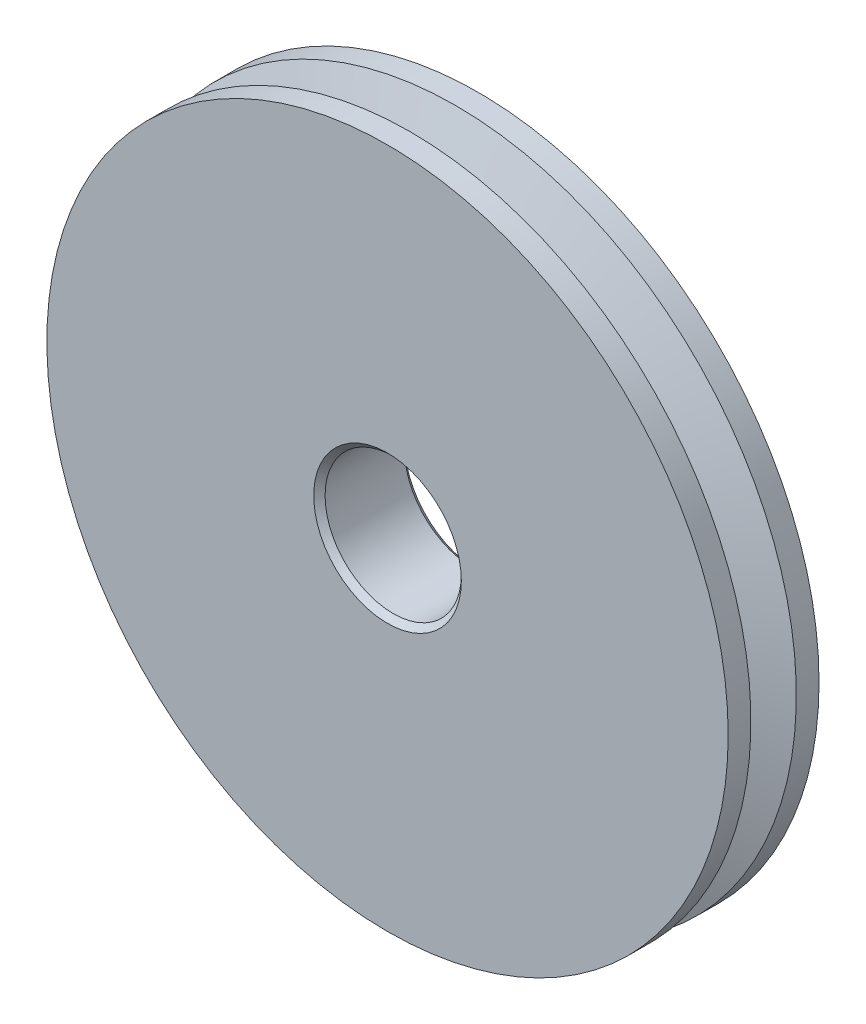
ISO-10303-21;
HEADER;
FILE_DESCRIPTION(('STEP AP214'),'2;1');
FILE_NAME('part.step','',(''),(''),'','','');
FILE_SCHEMA(('AUTOMOTIVE_DESIGN { 1 0 10303 214 1 1 1 1 }'));
ENDSEC;
DATA;
#1=APPLICATION_CONTEXT('core data for automotive mechanical design processes');
#2=APPLICATION_PROTOCOL_DEFINITION('international standard','automotive_design',2000,#1);
#3=PRODUCT_CONTEXT('',#1,'mechanical');
#4=PRODUCT('Part','Part','',(#3));
#5=PRODUCT_RELATED_PRODUCT_CATEGORY('part','',(#4));
#6=PRODUCT_DEFINITION_FORMATION('','',#4);
#7=PRODUCT_DEFINITION_CONTEXT('part definition',#1,'design');
#8=PRODUCT_DEFINITION('design','',#6,#7);
#9=PRODUCT_DEFINITION_SHAPE('','',#8);
#10=(LENGTH_UNIT() NAMED_UNIT(*) SI_UNIT(.MILLI.,.METRE.));
#11=(NAMED_UNIT(*) PLANE_ANGLE_UNIT() SI_UNIT($,.RADIAN.));
#12=(NAMED_UNIT(*) SI_UNIT($,.STERADIAN.) SOLID_ANGLE_UNIT());
#13=UNCERTAINTY_MEASURE_WITH_UNIT(LENGTH_MEASURE(1.E-05),#10,'distance_accuracy_value','');
#14=(GEOMETRIC_REPRESENTATION_CONTEXT(3) GLOBAL_UNCERTAINTY_ASSIGNED_CONTEXT((#13)) GLOBAL_UNIT_ASSIGNED_CONTEXT((#10,
#11,#12)) REPRESENTATION_CONTEXT('',''));
#15=CARTESIAN_POINT('',(0.,0.,0.));
#16=DIRECTION('',(0.,0.,1.));
#17=DIRECTION('',(1.,0.,0.));
#18=AXIS2_PLACEMENT_3D('',#15,#16,#17);
#19=CARTESIAN_POINT('',(0.,0.,6.35));
#20=DIRECTION('',(0.,0.,-1.));
#21=DIRECTION('',(-1.,0.,0.));
#22=AXIS2_PLACEMENT_3D('',#19,#20,#21);
#23=CYLINDRICAL_SURFACE('',#22,47.625);
#24=CARTESIAN_POINT('',(0.,0.,6.35));
#25=DIRECTION('',(0.,0.,1.));
#26=DIRECTION('',(1.,0.,0.));
#27=AXIS2_PLACEMENT_3D('',#24,#25,#26);
#28=CIRCLE('',#27,47.625);
#29=CARTESIAN_POINT('',(47.625,0.,6.35));
#30=VERTEX_POINT('',#29);
#31=EDGE_CURVE('E53',#30,#30,#28,.T.);
#32=ORIENTED_EDGE('',*,*,#31,.F.);
#33=EDGE_LOOP('',(#32));
#34=FACE_BOUND('',#33,.T.);
#35=CARTESIAN_POINT('',(0.,0.,3.17500000000005));
#36=DIRECTION('',(0.,0.,1.));
#37=DIRECTION('',(0.,-1.,0.));
#38=AXIS2_PLACEMENT_3D('',#35,#36,#37);
#39=CIRCLE('',#38,47.625);
#40=CARTESIAN_POINT('',(0.,-47.625,3.1750000000001));
#41=VERTEX_POINT('',#40);
#42=EDGE_CURVE('E57',#41,#41,#39,.T.);
#43=ORIENTED_EDGE('',*,*,#42,.T.);
#44=EDGE_LOOP('',(#43));
#45=FACE_BOUND('',#44,.T.);
#46=ADVANCED_FACE('F33',(#34,#45),#23,.T.);
#47=CARTESIAN_POINT('',(0.,0.,-6.35));
#48=DIRECTION('',(0.,0.,1.));
#49=DIRECTION('',(1.,0.,0.));
#50=AXIS2_PLACEMENT_3D('',#47,#48,#49);
#51=CIRCLE('',#50,47.625);
#52=CARTESIAN_POINT('',(47.625,0.,-6.35));
#53=VERTEX_POINT('',#52);
#54=EDGE_CURVE('E54',#53,#53,#51,.T.);
#55=ORIENTED_EDGE('',*,*,#54,.T.);
#56=EDGE_LOOP('',(#55));
#57=FACE_BOUND('',#56,.T.);
#58=CARTESIAN_POINT('',(0.,0.,-3.17499999999995));
#59=DIRECTION('',(0.,0.,1.));
#60=DIRECTION('',(0.,-1.,0.));
#61=AXIS2_PLACEMENT_3D('',#58,#59,#60);
#62=CIRCLE('',#61,47.625);
#63=CARTESIAN_POINT('',(0.,-47.625,-3.1749999999999));
#64=VERTEX_POINT('',#63);
#65=EDGE_CURVE('E62',#64,#64,#62,.T.);
#66=ORIENTED_EDGE('',*,*,#65,.F.);
#67=EDGE_LOOP('',(#66));
#68=FACE_BOUND('',#67,.T.);
#69=ADVANCED_FACE('F86',(#57,#68),#23,.T.);
#70=CARTESIAN_POINT('',(0.,0.,6.35));
#71=DIRECTION('',(0.,0.,1.));
#72=DIRECTION('',(1.,0.,0.));
#73=AXIS2_PLACEMENT_3D('',#70,#71,#72);
#74=PLANE('',#73);
#75=CARTESIAN_POINT('',(0.,0.,6.35));
#76=DIRECTION('',(0.,0.,1.));
#77=DIRECTION('',(1.,0.,0.));
#78=AXIS2_PLACEMENT_3D('',#75,#76,#77);
#79=CIRCLE('',#78,10.31875);
#80=CARTESIAN_POINT('',(10.31875,0.,6.35));
#81=VERTEX_POINT('',#80);
#82=EDGE_CURVE('E10',#81,#81,#79,.F.);
#83=ORIENTED_EDGE('',*,*,#82,.T.);
#84=EDGE_LOOP('',(#83));
#85=FACE_BOUND('',#84,.T.);
#86=ORIENTED_EDGE('',*,*,#31,.T.);
#87=EDGE_LOOP('',(#86));
#88=FACE_BOUND('',#87,.T.);
#89=ADVANCED_FACE('F92',(#85,#88),#74,.T.);
#90=CARTESIAN_POINT('',(0.,0.,-6.35));
#91=DIRECTION('',(0.,0.,1.));
#92=DIRECTION('',(1.,0.,0.));
#93=AXIS2_PLACEMENT_3D('',#90,#91,#92);
#94=PLANE('',#93);
#95=CARTESIAN_POINT('',(0.,0.,-6.35));
#96=DIRECTION('',(0.,0.,1.));
#97=DIRECTION('',(1.,0.,0.));
#98=AXIS2_PLACEMENT_3D('',#95,#96,#97);
#99=CIRCLE('',#98,10.31875);
#100=CARTESIAN_POINT('',(-10.31875,0.,-6.35));
#101=VERTEX_POINT('',#100);
#102=EDGE_CURVE('E48',#101,#101,#99,.T.);
#103=ORIENTED_EDGE('',*,*,#102,.T.);
#104=EDGE_LOOP('',(#103));
#105=FACE_BOUND('',#104,.T.);
#106=ORIENTED_EDGE('',*,*,#54,.F.);
#107=EDGE_LOOP('',(#106));
#108=FACE_BOUND('',#107,.T.);
#109=ADVANCED_FACE('F97',(#105,#108),#94,.F.);
#110=CARTESIAN_POINT('',(0.,0.,6.35));
#111=DIRECTION('',(0.,0.,-1.));
#112=DIRECTION('',(-1.,0.,0.));
#113=AXIS2_PLACEMENT_3D('',#110,#111,#112);
#114=CYLINDRICAL_SURFACE('',#113,9.525);
#115=CARTESIAN_POINT('',(0.,0.,-5.55624999999998));
#116=DIRECTION('',(0.,0.,1.));
#117=DIRECTION('',(1.,0.,0.));
#118=AXIS2_PLACEMENT_3D('',#115,#116,#117);
#119=CIRCLE('',#118,9.525);
#120=CARTESIAN_POINT('',(-9.525,0.,-5.55624999999998));
#121=VERTEX_POINT('',#120);
#122=EDGE_CURVE('E40',#121,#121,#119,.F.);
#123=ORIENTED_EDGE('',*,*,#122,.T.);
#124=EDGE_LOOP('',(#123));
#125=FACE_BOUND('',#124,.T.);
#126=CARTESIAN_POINT('',(0.,0.,5.55625000000004));
#127=DIRECTION('',(0.,0.,1.));
#128=DIRECTION('',(1.,0.,0.));
#129=AXIS2_PLACEMENT_3D('',#126,#127,#128);
#130=CIRCLE('',#129,9.525);
#131=CARTESIAN_POINT('',(9.525,0.,5.55625000000004));
#132=VERTEX_POINT('',#131);
#133=EDGE_CURVE('E44',#132,#132,#130,.T.);
#134=ORIENTED_EDGE('',*,*,#133,.T.);
#135=EDGE_LOOP('',(#134));
#136=FACE_BOUND('',#135,.T.);
#137=ADVANCED_FACE('F101',(#125,#136),#114,.F.);
#138=CARTESIAN_POINT('',(0.,0.,-6.35));
#139=DIRECTION('',(0.,0.,-1.));
#140=DIRECTION('',(-1.,0.,0.));
#141=AXIS2_PLACEMENT_3D('',#138,#139,#140);
#142=CONICAL_SURFACE('',#141,10.31875,0.785398163397437);
#143=CARTESIAN_POINT('',(-9.525,0.,-5.55624999999998));
#144=CARTESIAN_POINT('',(-9.53326822916667,0.,-5.56451822916665));
#145=CARTESIAN_POINT('',(-9.54153645833333,0.,-5.57278645833332));
#146=CARTESIAN_POINT('',(-9.55807291666667,0.,-5.58932291666665));
#147=CARTESIAN_POINT('',(-9.56634114583333,0.,-5.59759114583332));
#148=CARTESIAN_POINT('',(-9.58287760416667,0.,-5.61412760416665));
#149=CARTESIAN_POINT('',(-9.59114583333333,0.,-5.62239583333332));
#150=CARTESIAN_POINT('',(-9.60768229166667,0.,-5.63893229166665));
#151=CARTESIAN_POINT('',(-9.61595052083334,0.,-5.64720052083332));
#152=CARTESIAN_POINT('',(-9.63248697916667,0.,-5.66373697916665));
#153=CARTESIAN_POINT('',(-9.64075520833333,0.,-5.67200520833332));
#154=CARTESIAN_POINT('',(-9.65729166666667,0.,-5.68854166666665));
#155=CARTESIAN_POINT('',(-9.66555989583333,0.,-5.69680989583332));
#156=CARTESIAN_POINT('',(-9.68209635416667,0.,-5.71334635416665));
#157=CARTESIAN_POINT('',(-9.69036458333333,0.,-5.72161458333332));
#158=CARTESIAN_POINT('',(-9.70690104166667,0.,-5.73815104166665));
#159=CARTESIAN_POINT('',(-9.71516927083333,0.,-5.74641927083332));
#160=CARTESIAN_POINT('',(-9.73170572916667,0.,-5.76295572916665));
#161=CARTESIAN_POINT('',(-9.73997395833333,0.,-5.77122395833332));
#162=CARTESIAN_POINT('',(-9.75651041666667,0.,-5.78776041666665));
#163=CARTESIAN_POINT('',(-9.76477864583333,0.,-5.79602864583332));
#164=CARTESIAN_POINT('',(-9.78131510416667,0.,-5.81256510416666));
#165=CARTESIAN_POINT('',(-9.78958333333333,0.,-5.82083333333332));
#166=CARTESIAN_POINT('',(-9.80611979166667,0.,-5.83736979166666));
#167=CARTESIAN_POINT('',(-9.81438802083333,0.,-5.84563802083332));
#168=CARTESIAN_POINT('',(-9.83092447916667,0.,-5.86217447916666));
#169=CARTESIAN_POINT('',(-9.83919270833333,0.,-5.87044270833332));
#170=CARTESIAN_POINT('',(-9.85572916666667,0.,-5.88697916666666));
#171=CARTESIAN_POINT('',(-9.86399739583333,0.,-5.89524739583332));
#172=CARTESIAN_POINT('',(-9.88053385416667,0.,-5.91178385416666));
#173=CARTESIAN_POINT('',(-9.88880208333333,0.,-5.92005208333332));
#174=CARTESIAN_POINT('',(-9.90533854166667,0.,-5.93658854166666));
#175=CARTESIAN_POINT('',(-9.91360677083333,0.,-5.94485677083332));
#176=CARTESIAN_POINT('',(-9.93014322916667,0.,-5.96139322916666));
#177=CARTESIAN_POINT('',(-9.93841145833333,0.,-5.96966145833332));
#178=CARTESIAN_POINT('',(-9.95494791666667,0.,-5.98619791666666));
#179=CARTESIAN_POINT('',(-9.96321614583333,0.,-5.99446614583333));
#180=CARTESIAN_POINT('',(-9.97975260416667,0.,-6.01100260416666));
#181=CARTESIAN_POINT('',(-9.98802083333334,0.,-6.01927083333333));
#182=CARTESIAN_POINT('',(-10.0045572916667,0.,-6.03580729166666));
#183=CARTESIAN_POINT('',(-10.0128255208333,0.,-6.04407552083333));
#184=CARTESIAN_POINT('',(-10.0293619791667,0.,-6.06061197916666));
#185=CARTESIAN_POINT('',(-10.0376302083333,0.,-6.06888020833333));
#186=CARTESIAN_POINT('',(-10.0541666666667,0.,-6.08541666666666));
#187=CARTESIAN_POINT('',(-10.0624348958333,0.,-6.09368489583333));
#188=CARTESIAN_POINT('',(-10.0789713541667,0.,-6.11022135416666));
#189=CARTESIAN_POINT('',(-10.0872395833333,0.,-6.11848958333333));
#190=CARTESIAN_POINT('',(-10.1037760416667,0.,-6.13502604166666));
#191=CARTESIAN_POINT('',(-10.1120442708333,0.,-6.14329427083333));
#192=CARTESIAN_POINT('',(-10.1285807291667,0.,-6.15983072916666));
#193=CARTESIAN_POINT('',(-10.1368489583333,0.,-6.16809895833333));
#194=CARTESIAN_POINT('',(-10.1533854166667,0.,-6.18463541666666));
#195=CARTESIAN_POINT('',(-10.1616536458333,0.,-6.19290364583333));
#196=CARTESIAN_POINT('',(-10.1781901041667,0.,-6.20944010416666));
#197=CARTESIAN_POINT('',(-10.1864583333333,0.,-6.21770833333333));
#198=CARTESIAN_POINT('',(-10.2029947916667,0.,-6.23424479166666));
#199=CARTESIAN_POINT('',(-10.2112630208333,0.,-6.24251302083333));
#200=CARTESIAN_POINT('',(-10.2277994791667,0.,-6.25904947916666));
#201=CARTESIAN_POINT('',(-10.2360677083333,0.,-6.26731770833333));
#202=CARTESIAN_POINT('',(-10.2526041666667,0.,-6.28385416666667));
#203=CARTESIAN_POINT('',(-10.2608723958333,0.,-6.29212239583333));
#204=CARTESIAN_POINT('',(-10.2774088541667,0.,-6.30865885416667));
#205=CARTESIAN_POINT('',(-10.2856770833333,0.,-6.31692708333333));
#206=CARTESIAN_POINT('',(-10.3022135416667,0.,-6.33346354166667));
#207=CARTESIAN_POINT('',(-10.3104817708333,0.,-6.34173177083333));
#208=CARTESIAN_POINT('',(-10.31875,0.,-6.35));
#209=B_SPLINE_CURVE_WITH_KNOTS('',3,(#143,#144,#145,#146,#147,#148,#149,#150,#151,#152,#153,
#154,#155,#156,#157,#158,#159,#160,#161,#162,#163,#164,#165,#166,#167,#168,#169,#170,#171,#172,
#173,#174,#175,#176,#177,#178,#179,#180,#181,#182,#183,#184,#185,#186,#187,#188,#189,#190,#191,
#192,#193,#194,#195,#196,#197,#198,#199,#200,#201,#202,#203,#204,#205,#206,#207,#208),
.UNSPECIFIED.,.F.,.F.,(4,2,2,2,2,2,2,2,2,2,2,2,2,2,2,2,2,2,2,2,2,2,2,2,2,2,2,2,2,2,2,2,4),(0.,
0.0350791254729274,0.0701582509458536,0.10523737641878,0.140316501891708,0.175395627364634,
0.21047475283756,0.245553878310488,0.280633003783414,0.315712129256341,0.350791254729269,
0.385870380202195,0.420949505675121,0.456028631148049,0.491107756620975,0.526186882093902,
0.56126600756683,0.596345133039756,0.631424258512682,0.66650338398561,0.701582509458536,
0.736661634931463,0.77174076040439,0.806819885877317,0.841899011350244,0.876978136823171,
0.912057262296097,0.947136387769025,0.982215513241951,1.01729463871488,1.05237376418781,
1.08745288966073,1.12253201513366),.UNSPECIFIED.);
#210=EDGE_CURVE('BSEAM99',#121,#101,#209,.T.);
#211=ORIENTED_EDGE('',*,*,#122,.F.);
#212=ORIENTED_EDGE('',*,*,#102,.F.);
#213=ORIENTED_EDGE('',*,*,#210,.T.);
#214=ORIENTED_EDGE('',*,*,#210,.F.);
#215=EDGE_LOOP('',(#211,#213,#212,#214));
#216=FACE_BOUND('',#215,.T.);
#217=ADVANCED_FACE('F99',(#216),#142,.F.);
#218=CARTESIAN_POINT('',(0.,0.,5.55625000000004));
#219=DIRECTION('',(0.,0.,1.));
#220=DIRECTION('',(1.,0.,0.));
#221=AXIS2_PLACEMENT_3D('',#218,#219,#220);
#222=CONICAL_SURFACE('',#221,9.525,0.785398163397455);
#223=ORIENTED_EDGE('',*,*,#82,.F.);
#224=EDGE_LOOP('',(#223));
#225=FACE_BOUND('',#224,.T.);
#226=ORIENTED_EDGE('',*,*,#133,.F.);
#227=EDGE_LOOP('',(#226));
#228=FACE_BOUND('',#227,.T.);
#229=ADVANCED_FACE('F35',(#225,#228),#222,.F.);
#230=CARTESIAN_POINT('',(0.,0.,3.17500000000005));
#231=DIRECTION('',(0.,0.,1.));
#232=DIRECTION('',(0.,-1.,0.));
#233=AXIS2_PLACEMENT_3D('',#230,#231,#232);
#234=CONICAL_SURFACE('',#233,47.625,1.22173047639603);
#235=CARTESIAN_POINT('',(0.,0.,0.863789012409679));
#236=DIRECTION('',(0.,0.,1.));
#237=DIRECTION('',(0.,-1.,0.));
#238=AXIS2_PLACEMENT_3D('',#235,#236,#237);
#239=CIRCLE('',#238,41.275);
#240=CARTESIAN_POINT('',(0.,-41.275,0.863789012409724));
#241=VERTEX_POINT('',#240);
#242=EDGE_CURVE('E68',#241,#241,#239,.T.);
#243=ORIENTED_EDGE('',*,*,#242,.T.);
#244=EDGE_LOOP('',(#243));
#245=FACE_BOUND('',#244,.T.);
#246=ORIENTED_EDGE('',*,*,#42,.F.);
#247=EDGE_LOOP('',(#246));
#248=FACE_BOUND('',#247,.T.);
#249=ADVANCED_FACE('F72',(#245,#248),#234,.T.);
#250=CARTESIAN_POINT('',(0.,0.,-0.863789012409589));
#251=DIRECTION('',(0.,0.,-1.));
#252=DIRECTION('',(0.,1.,0.));
#253=AXIS2_PLACEMENT_3D('',#250,#251,#252);
#254=CONICAL_SURFACE('',#253,41.275,1.22173047639603);
#255=ORIENTED_EDGE('',*,*,#65,.T.);
#256=EDGE_LOOP('',(#255));
#257=FACE_BOUND('',#256,.T.);
#258=CARTESIAN_POINT('',(0.,0.,-0.863789012409589));
#259=DIRECTION('',(0.,0.,1.));
#260=DIRECTION('',(0.,-1.,0.));
#261=AXIS2_PLACEMENT_3D('',#258,#259,#260);
#262=CIRCLE('',#261,41.275);
#263=CARTESIAN_POINT('',(0.,-41.275,-0.863789012409544));
#264=VERTEX_POINT('',#263);
#265=EDGE_CURVE('E65',#264,#264,#262,.T.);
#266=ORIENTED_EDGE('',*,*,#265,.F.);
#267=EDGE_LOOP('',(#266));
#268=FACE_BOUND('',#267,.T.);
#269=ADVANCED_FACE('F77',(#257,#268),#254,.T.);
#270=CARTESIAN_POINT('',(0.,0.,6.35));
#271=DIRECTION('',(0.,0.,1.));
#272=DIRECTION('',(0.,-1.,0.));
#273=AXIS2_PLACEMENT_3D('',#270,#271,#272);
#274=CYLINDRICAL_SURFACE('',#273,41.275);
#275=ORIENTED_EDGE('',*,*,#265,.T.);
#276=EDGE_LOOP('',(#275));
#277=FACE_BOUND('',#276,.T.);
#278=ORIENTED_EDGE('',*,*,#242,.F.);
#279=EDGE_LOOP('',(#278));
#280=FACE_BOUND('',#279,.T.);
#281=ADVANCED_FACE('F75',(#277,#280),#274,.T.);
#282=CLOSED_SHELL('',(#46,#69,#89,#109,#137,#217,#229,#249,#269,#281));
#283=MANIFOLD_SOLID_BREP('B2',#282);
#284=ADVANCED_BREP_SHAPE_REPRESENTATION('',(#18,#283),#14);
#285=SHAPE_DEFINITION_REPRESENTATION(#9,#284);
ENDSEC;
END-ISO-10303-21;
